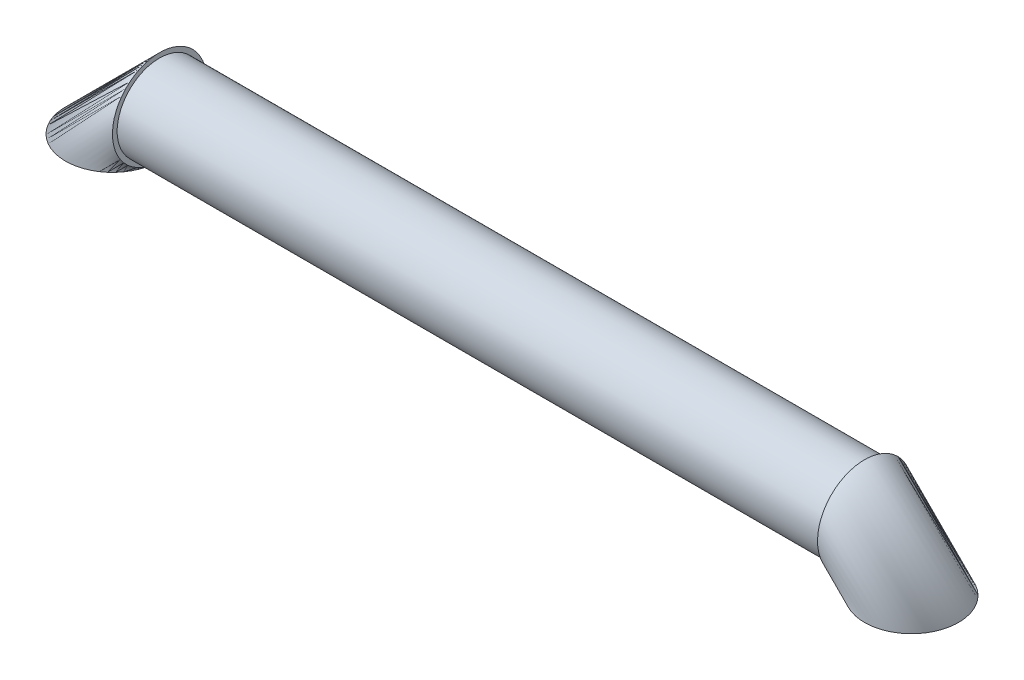
ISO-10303-21;
HEADER;
FILE_DESCRIPTION(('STEP AP214'),'2;1');
FILE_NAME('part.step','',(''),(''),'','','');
FILE_SCHEMA(('AUTOMOTIVE_DESIGN { 1 0 10303 214 1 1 1 1 }'));
ENDSEC;
DATA;
#1=APPLICATION_CONTEXT('core data for automotive mechanical design processes');
#2=APPLICATION_PROTOCOL_DEFINITION('international standard','automotive_design',2000,#1);
#3=PRODUCT_CONTEXT('',#1,'mechanical');
#4=PRODUCT('Part','Part','',(#3));
#5=PRODUCT_RELATED_PRODUCT_CATEGORY('part','',(#4));
#6=PRODUCT_DEFINITION_FORMATION('','',#4);
#7=PRODUCT_DEFINITION_CONTEXT('part definition',#1,'design');
#8=PRODUCT_DEFINITION('design','',#6,#7);
#9=PRODUCT_DEFINITION_SHAPE('','',#8);
#10=(LENGTH_UNIT() NAMED_UNIT(*) SI_UNIT(.MILLI.,.METRE.));
#11=(NAMED_UNIT(*) PLANE_ANGLE_UNIT() SI_UNIT($,.RADIAN.));
#12=(NAMED_UNIT(*) SI_UNIT($,.STERADIAN.) SOLID_ANGLE_UNIT());
#13=UNCERTAINTY_MEASURE_WITH_UNIT(LENGTH_MEASURE(1.E-05),#10,'distance_accuracy_value','');
#14=(GEOMETRIC_REPRESENTATION_CONTEXT(3) GLOBAL_UNCERTAINTY_ASSIGNED_CONTEXT((#13)) GLOBAL_UNIT_ASSIGNED_CONTEXT((#10,
#11,#12)) REPRESENTATION_CONTEXT('',''));
#15=CARTESIAN_POINT('',(0.,0.,0.));
#16=DIRECTION('',(0.,0.,1.));
#17=DIRECTION('',(1.,0.,0.));
#18=AXIS2_PLACEMENT_3D('',#15,#16,#17);
#19=CARTESIAN_POINT('',(0.,0.,0.));
#20=DIRECTION('',(0.,1.,0.));
#21=DIRECTION('',(0.,0.,1.));
#22=AXIS2_PLACEMENT_3D('',#19,#20,#21);
#23=PLANE('',#22);
#24=CARTESIAN_POINT('',(0.,0.,0.));
#25=DIRECTION('',(0.,1.,0.));
#26=DIRECTION('',(0.,0.,1.));
#27=AXIS2_PLACEMENT_3D('',#24,#25,#26);
#28=CIRCLE('',#27,50.);
#29=CARTESIAN_POINT('',(50.,0.,0.));
#30=VERTEX_POINT('',#29);
#31=EDGE_CURVE('E56',#30,#30,#28,.T.);
#32=ORIENTED_EDGE('',*,*,#31,.F.);
#33=EDGE_LOOP('',(#32));
#34=FACE_BOUND('',#33,.T.);
#35=ADVANCED_FACE('F47',(#34),#23,.F.);
#36=CARTESIAN_POINT('',(50.,0.,0.));
#37=DIRECTION('',(0.,0.,-1.));
#38=DIRECTION('',(-1.,0.,0.));
#39=AXIS2_PLACEMENT_3D('',#36,#37,#38);
#40=DEGENERATE_TOROIDAL_SURFACE('',#39,50.,50.,.T.);
#41=CARTESIAN_POINT('',(50.,50.,0.));
#42=DIRECTION('',(1.,0.,0.));
#43=DIRECTION('',(0.,0.,1.));
#44=AXIS2_PLACEMENT_3D('',#41,#42,#43);
#45=CIRCLE('',#44,50.);
#46=EDGE_CURVE('E11',#30,#30,#45,.T.);
#47=ORIENTED_EDGE('',*,*,#46,.F.);
#48=ORIENTED_EDGE('',*,*,#31,.T.);
#49=EDGE_LOOP('',(#47,#48));
#50=FACE_BOUND('',#49,.T.);
#51=ADVANCED_FACE('F97',(#50),#40,.T.);
#52=CARTESIAN_POINT('',(50.,50.,0.));
#53=DIRECTION('',(1.,0.,0.));
#54=DIRECTION('',(0.,0.,-1.));
#55=AXIS2_PLACEMENT_3D('',#52,#53,#54);
#56=PLANE('',#55);
#57=ORIENTED_EDGE('',*,*,#46,.T.);
#58=EDGE_LOOP('',(#57));
#59=FACE_BOUND('',#58,.T.);
#60=CARTESIAN_POINT('',(50.,50.,0.));
#61=DIRECTION('',(1.,0.,0.));
#62=DIRECTION('',(0.,0.,-1.));
#63=AXIS2_PLACEMENT_3D('',#60,#61,#62);
#64=CIRCLE('',#63,45.);
#65=CARTESIAN_POINT('',(50.,50.,-45.));
#66=VERTEX_POINT('',#65);
#67=EDGE_CURVE('E76',#66,#66,#64,.T.);
#68=ORIENTED_EDGE('',*,*,#67,.F.);
#69=EDGE_LOOP('',(#68));
#70=FACE_BOUND('',#69,.T.);
#71=ADVANCED_FACE('F95',(#59,#70),#56,.T.);
#72=CARTESIAN_POINT('',(941.421356237309,50.,0.));
#73=DIRECTION('',(-1.,0.,0.));
#74=DIRECTION('',(0.,0.,1.));
#75=AXIS2_PLACEMENT_3D('',#72,#73,#74);
#76=CYLINDRICAL_SURFACE('',#75,45.);
#77=ORIENTED_EDGE('',*,*,#67,.T.);
#78=EDGE_LOOP('',(#77));
#79=FACE_BOUND('',#78,.T.);
#80=CARTESIAN_POINT('',(800.,50.,0.));
#81=DIRECTION('',(1.,0.,0.));
#82=DIRECTION('',(0.,0.,-1.));
#83=AXIS2_PLACEMENT_3D('',#80,#81,#82);
#84=CIRCLE('',#83,45.);
#85=CARTESIAN_POINT('',(800.,50.,-45.));
#86=VERTEX_POINT('',#85);
#87=EDGE_CURVE('E84',#86,#86,#84,.T.);
#88=ORIENTED_EDGE('',*,*,#87,.F.);
#89=EDGE_LOOP('',(#88));
#90=FACE_BOUND('',#89,.T.);
#91=ADVANCED_FACE('F92',(#79,#90),#76,.T.);
#92=CARTESIAN_POINT('',(800.,0.,0.));
#93=DIRECTION('',(1.,0.,0.));
#94=DIRECTION('',(0.,0.,-1.));
#95=AXIS2_PLACEMENT_3D('',#92,#93,#94);
#96=PLANE('',#95);
#97=ORIENTED_EDGE('',*,*,#87,.T.);
#98=EDGE_LOOP('',(#97));
#99=FACE_BOUND('',#98,.T.);
#100=CARTESIAN_POINT('',(800.,50.,0.));
#101=DIRECTION('',(1.,0.,0.));
#102=DIRECTION('',(0.,0.,-1.));
#103=AXIS2_PLACEMENT_3D('',#100,#101,#102);
#104=CIRCLE('',#103,50.);
#105=CARTESIAN_POINT('',(800.,0.,0.));
#106=VERTEX_POINT('',#105);
#107=EDGE_CURVE('E66',#106,#106,#104,.T.);
#108=ORIENTED_EDGE('',*,*,#107,.F.);
#109=EDGE_LOOP('',(#108));
#110=FACE_BOUND('',#109,.T.);
#111=ADVANCED_FACE('F103',(#99,#110),#96,.F.);
#112=CARTESIAN_POINT('',(850.,0.,0.));
#113=DIRECTION('',(0.,1.,0.));
#114=DIRECTION('',(0.,0.,1.));
#115=AXIS2_PLACEMENT_3D('',#112,#113,#114);
#116=PLANE('',#115);
#117=CARTESIAN_POINT('',(850.,0.,0.));
#118=DIRECTION('',(0.,-1.,0.));
#119=DIRECTION('',(0.,0.,1.));
#120=AXIS2_PLACEMENT_3D('',#117,#118,#119);
#121=CIRCLE('',#120,50.);
#122=EDGE_CURVE('E69',#106,#106,#121,.F.);
#123=ORIENTED_EDGE('',*,*,#122,.F.);
#124=EDGE_LOOP('',(#123));
#125=FACE_BOUND('',#124,.T.);
#126=ADVANCED_FACE('F123',(#125),#116,.F.);
#127=CARTESIAN_POINT('',(800.,0.,0.));
#128=DIRECTION('',(0.,0.,1.));
#129=DIRECTION('',(1.,0.,0.));
#130=AXIS2_PLACEMENT_3D('',#127,#128,#129);
#131=TOROIDAL_SURFACE('',#130,50.,50.);
#132=ORIENTED_EDGE('',*,*,#107,.T.);
#133=ORIENTED_EDGE('',*,*,#122,.T.);
#134=EDGE_LOOP('',(#132,#133));
#135=FACE_BOUND('',#134,.T.);
#136=ADVANCED_FACE('F67',(#135),#131,.T.);
#137=CLOSED_SHELL('',(#35,#51,#71,#91,#111,#126,#136));
#138=MANIFOLD_SOLID_BREP('B2',#137);
#139=ADVANCED_BREP_SHAPE_REPRESENTATION('',(#18,#138),#14);
#140=SHAPE_DEFINITION_REPRESENTATION(#9,#139);
ENDSEC;
END-ISO-10303-21;
